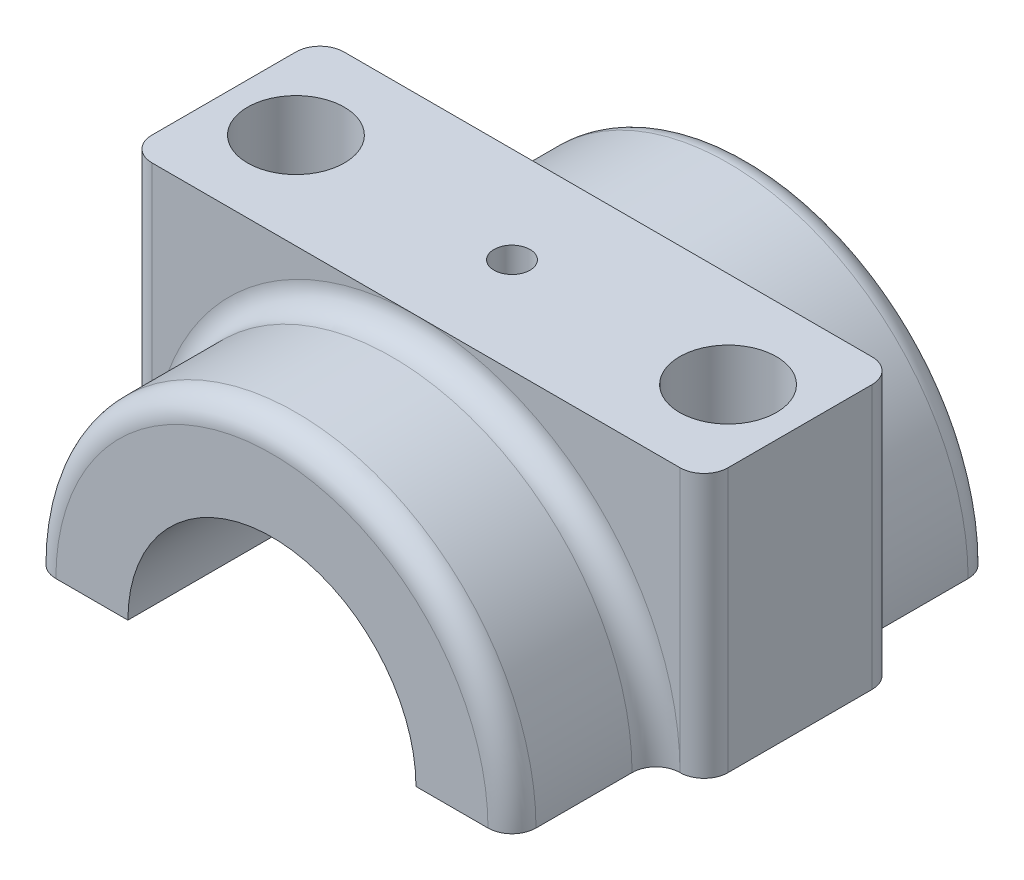
ISO-10303-21;
HEADER;
FILE_DESCRIPTION(('STEP AP214'),'2;1');
FILE_NAME('part.step','',(''),(''),'','','');
FILE_SCHEMA(('AUTOMOTIVE_DESIGN { 1 0 10303 214 1 1 1 1 }'));
ENDSEC;
DATA;
#1=APPLICATION_CONTEXT('core data for automotive mechanical design processes');
#2=APPLICATION_PROTOCOL_DEFINITION('international standard','automotive_design',2000,#1);
#3=PRODUCT_CONTEXT('',#1,'mechanical');
#4=PRODUCT('Part','Part','',(#3));
#5=PRODUCT_RELATED_PRODUCT_CATEGORY('part','',(#4));
#6=PRODUCT_DEFINITION_FORMATION('','',#4);
#7=PRODUCT_DEFINITION_CONTEXT('part definition',#1,'design');
#8=PRODUCT_DEFINITION('design','',#6,#7);
#9=PRODUCT_DEFINITION_SHAPE('','',#8);
#10=(LENGTH_UNIT() NAMED_UNIT(*) SI_UNIT(.MILLI.,.METRE.));
#11=(NAMED_UNIT(*) PLANE_ANGLE_UNIT() SI_UNIT($,.RADIAN.));
#12=(NAMED_UNIT(*) SI_UNIT($,.STERADIAN.) SOLID_ANGLE_UNIT());
#13=UNCERTAINTY_MEASURE_WITH_UNIT(LENGTH_MEASURE(1.E-05),#10,'distance_accuracy_value','');
#14=(GEOMETRIC_REPRESENTATION_CONTEXT(3) GLOBAL_UNCERTAINTY_ASSIGNED_CONTEXT((#13)) GLOBAL_UNIT_ASSIGNED_CONTEXT((#10,
#11,#12)) REPRESENTATION_CONTEXT('',''));
#15=CARTESIAN_POINT('',(0.,0.,0.));
#16=DIRECTION('',(0.,0.,1.));
#17=DIRECTION('',(1.,0.,0.));
#18=AXIS2_PLACEMENT_3D('',#15,#16,#17);
#19=CARTESIAN_POINT('',(0.,33.,0.));
#20=DIRECTION('',(0.,0.,-1.));
#21=DIRECTION('',(-1.,0.,0.));
#22=AXIS2_PLACEMENT_3D('',#19,#20,#21);
#23=PLANE('',#22);
#24=DIRECTION('',(0.,-1.,0.));
#25=VECTOR('',#24,1.);
#26=CARTESIAN_POINT('',(3.,33.,0.));
#27=LINE('',#26,#25);
#28=CARTESIAN_POINT('',(3.,33.,0.));
#29=VERTEX_POINT('',#28);
#30=CARTESIAN_POINT('',(3.,0.,0.));
#31=VERTEX_POINT('',#30);
#32=EDGE_CURVE('E266',#29,#31,#27,.T.);
#33=ORIENTED_EDGE('',*,*,#32,.T.);
#34=CARTESIAN_POINT('',(36.,0.,0.));
#35=DIRECTION('',(0.,0.,-1.));
#36=DIRECTION('',(-1.,0.,0.));
#37=AXIS2_PLACEMENT_3D('',#34,#35,#36);
#38=CIRCLE('',#37,33.);
#39=CARTESIAN_POINT('',(36.,33.,0.));
#40=VERTEX_POINT('',#39);
#41=EDGE_CURVE('E46',#31,#40,#38,.T.);
#42=ORIENTED_EDGE('',*,*,#41,.T.);
#43=DIRECTION('',(1.,0.,0.));
#44=VECTOR('',#43,1.);
#45=CARTESIAN_POINT('',(0.,33.,0.));
#46=LINE('',#45,#44);
#47=EDGE_CURVE('E244',#29,#40,#46,.T.);
#48=ORIENTED_EDGE('',*,*,#47,.F.);
#49=EDGE_LOOP('',(#33,#42,#48));
#50=FACE_BOUND('',#49,.T.);
#51=ADVANCED_FACE('F31',(#50),#23,.F.);
#52=CARTESIAN_POINT('',(72.,33.,-24.));
#53=DIRECTION('',(0.,0.,1.));
#54=DIRECTION('',(1.,0.,0.));
#55=AXIS2_PLACEMENT_3D('',#52,#53,#54);
#56=PLANE('',#55);
#57=DIRECTION('',(0.,-1.,0.));
#58=VECTOR('',#57,1.);
#59=CARTESIAN_POINT('',(69.,33.,-24.));
#60=LINE('',#59,#58);
#61=CARTESIAN_POINT('',(69.,33.,-24.));
#62=VERTEX_POINT('',#61);
#63=CARTESIAN_POINT('',(69.,0.,-24.));
#64=VERTEX_POINT('',#63);
#65=EDGE_CURVE('E291',#62,#64,#60,.T.);
#66=ORIENTED_EDGE('',*,*,#65,.T.);
#67=CARTESIAN_POINT('',(36.,0.,-24.));
#68=DIRECTION('',(0.,0.,1.));
#69=DIRECTION('',(1.,0.,0.));
#70=AXIS2_PLACEMENT_3D('',#67,#68,#69);
#71=CIRCLE('',#70,33.);
#72=CARTESIAN_POINT('',(36.,33.,-24.));
#73=VERTEX_POINT('',#72);
#74=EDGE_CURVE('E54',#64,#73,#71,.T.);
#75=ORIENTED_EDGE('',*,*,#74,.T.);
#76=DIRECTION('',(-1.,0.,0.));
#77=VECTOR('',#76,1.);
#78=CARTESIAN_POINT('',(72.,33.,-24.));
#79=LINE('',#78,#77);
#80=EDGE_CURVE('E251',#62,#73,#79,.T.);
#81=ORIENTED_EDGE('',*,*,#80,.F.);
#82=EDGE_LOOP('',(#66,#75,#81));
#83=FACE_BOUND('',#82,.T.);
#84=ADVANCED_FACE('F366',(#83),#56,.F.);
#85=CARTESIAN_POINT('',(3.,33.,-24.));
#86=VERTEX_POINT('',#85);
#87=EDGE_CURVE('E250',#73,#86,#79,.T.);
#88=ORIENTED_EDGE('',*,*,#87,.F.);
#89=CARTESIAN_POINT('',(36.,0.,-24.));
#90=DIRECTION('',(0.,0.,1.));
#91=DIRECTION('',(1.,0.,0.));
#92=AXIS2_PLACEMENT_3D('',#89,#90,#91);
#93=CIRCLE('',#92,33.);
#94=CARTESIAN_POINT('',(3.,0.,-24.));
#95=VERTEX_POINT('',#94);
#96=EDGE_CURVE('E315',#73,#95,#93,.T.);
#97=ORIENTED_EDGE('',*,*,#96,.T.);
#98=DIRECTION('',(0.,-1.,0.));
#99=VECTOR('',#98,1.);
#100=CARTESIAN_POINT('',(3.,33.,-24.));
#101=LINE('',#100,#99);
#102=EDGE_CURVE('E293',#95,#86,#101,.F.);
#103=ORIENTED_EDGE('',*,*,#102,.T.);
#104=EDGE_LOOP('',(#88,#97,#103));
#105=FACE_BOUND('',#104,.T.);
#106=ADVANCED_FACE('F372',(#105),#56,.F.);
#107=CARTESIAN_POINT('',(69.,33.,0.));
#108=VERTEX_POINT('',#107);
#109=EDGE_CURVE('E243',#40,#108,#46,.T.);
#110=ORIENTED_EDGE('',*,*,#109,.F.);
#111=CARTESIAN_POINT('',(36.,0.,0.));
#112=DIRECTION('',(0.,0.,-1.));
#113=DIRECTION('',(-1.,0.,0.));
#114=AXIS2_PLACEMENT_3D('',#111,#112,#113);
#115=CIRCLE('',#114,33.);
#116=CARTESIAN_POINT('',(69.,0.,0.));
#117=VERTEX_POINT('',#116);
#118=EDGE_CURVE('E326',#40,#117,#115,.T.);
#119=ORIENTED_EDGE('',*,*,#118,.T.);
#120=DIRECTION('',(0.,-1.,0.));
#121=VECTOR('',#120,1.);
#122=CARTESIAN_POINT('',(69.,33.,0.));
#123=LINE('',#122,#121);
#124=EDGE_CURVE('E254',#117,#108,#123,.F.);
#125=ORIENTED_EDGE('',*,*,#124,.T.);
#126=EDGE_LOOP('',(#110,#119,#125));
#127=FACE_BOUND('',#126,.T.);
#128=ADVANCED_FACE('F345',(#127),#23,.F.);
#129=CARTESIAN_POINT('',(0.,33.,0.));
#130=DIRECTION('',(0.,1.,0.));
#131=DIRECTION('',(0.,0.,1.));
#132=AXIS2_PLACEMENT_3D('',#129,#130,#131);
#133=PLANE('',#132);
#134=CARTESIAN_POINT('',(63.,33.,-12.));
#135=DIRECTION('',(0.,1.,0.));
#136=DIRECTION('',(0.,0.,1.));
#137=AXIS2_PLACEMENT_3D('',#134,#135,#136);
#138=CIRCLE('',#137,6.04999999999998);
#139=CARTESIAN_POINT('',(63.,33.,-5.95000000000002));
#140=VERTEX_POINT('',#139);
#141=EDGE_CURVE('E228',#140,#140,#138,.T.);
#142=ORIENTED_EDGE('',*,*,#141,.F.);
#143=EDGE_LOOP('',(#142));
#144=FACE_BOUND('',#143,.T.);
#145=DIRECTION('',(0.,0.,1.));
#146=VECTOR('',#145,1.);
#147=CARTESIAN_POINT('',(0.,33.,-24.));
#148=LINE('',#147,#146);
#149=CARTESIAN_POINT('',(0.,33.,-21.));
#150=VERTEX_POINT('',#149);
#151=CARTESIAN_POINT('',(0.,33.,-3.));
#152=VERTEX_POINT('',#151);
#153=EDGE_CURVE('E240',#150,#152,#148,.T.);
#154=ORIENTED_EDGE('',*,*,#153,.T.);
#155=CARTESIAN_POINT('',(3.,33.,-3.));
#156=DIRECTION('',(0.,1.,0.));
#157=DIRECTION('',(0.,0.,1.));
#158=AXIS2_PLACEMENT_3D('',#155,#156,#157);
#159=CIRCLE('',#158,3.);
#160=EDGE_CURVE('E289',#152,#29,#159,.T.);
#161=ORIENTED_EDGE('',*,*,#160,.T.);
#162=ORIENTED_EDGE('',*,*,#47,.T.);
#163=ORIENTED_EDGE('',*,*,#109,.T.);
#164=CARTESIAN_POINT('',(69.,33.,-3.));
#165=DIRECTION('',(0.,1.,0.));
#166=DIRECTION('',(0.,0.,1.));
#167=AXIS2_PLACEMENT_3D('',#164,#165,#166);
#168=CIRCLE('',#167,3.);
#169=CARTESIAN_POINT('',(72.,33.,-3.));
#170=VERTEX_POINT('',#169);
#171=EDGE_CURVE('E283',#108,#170,#168,.T.);
#172=ORIENTED_EDGE('',*,*,#171,.T.);
#173=DIRECTION('',(0.,0.,-1.));
#174=VECTOR('',#173,1.);
#175=CARTESIAN_POINT('',(72.,33.,0.));
#176=LINE('',#175,#174);
#177=CARTESIAN_POINT('',(72.,33.,-21.));
#178=VERTEX_POINT('',#177);
#179=EDGE_CURVE('E247',#170,#178,#176,.T.);
#180=ORIENTED_EDGE('',*,*,#179,.T.);
#181=CARTESIAN_POINT('',(69.,33.,-21.));
#182=DIRECTION('',(0.,1.,0.));
#183=DIRECTION('',(0.,0.,1.));
#184=AXIS2_PLACEMENT_3D('',#181,#182,#183);
#185=CIRCLE('',#184,3.);
#186=EDGE_CURVE('E285',#178,#62,#185,.T.);
#187=ORIENTED_EDGE('',*,*,#186,.T.);
#188=ORIENTED_EDGE('',*,*,#80,.T.);
#189=ORIENTED_EDGE('',*,*,#87,.T.);
#190=CARTESIAN_POINT('',(3.,33.,-21.));
#191=DIRECTION('',(0.,1.,0.));
#192=DIRECTION('',(0.,0.,1.));
#193=AXIS2_PLACEMENT_3D('',#190,#191,#192);
#194=CIRCLE('',#193,3.);
#195=EDGE_CURVE('E287',#86,#150,#194,.T.);
#196=ORIENTED_EDGE('',*,*,#195,.T.);
#197=EDGE_LOOP('',(#154,#161,#162,#163,#172,#180,#187,#188,#189,#196));
#198=FACE_BOUND('',#197,.T.);
#199=CARTESIAN_POINT('',(8.99999999999999,33.,-12.));
#200=DIRECTION('',(0.,1.,0.));
#201=DIRECTION('',(0.,0.,1.));
#202=AXIS2_PLACEMENT_3D('',#199,#200,#201);
#203=CIRCLE('',#202,6.05);
#204=CARTESIAN_POINT('',(8.99999999999999,33.,-5.95));
#205=VERTEX_POINT('',#204);
#206=EDGE_CURVE('E234',#205,#205,#203,.T.);
#207=ORIENTED_EDGE('',*,*,#206,.F.);
#208=EDGE_LOOP('',(#207));
#209=FACE_BOUND('',#208,.T.);
#210=CARTESIAN_POINT('',(36.,33.,-12.));
#211=DIRECTION('',(0.,1.,0.));
#212=DIRECTION('',(0.,0.,1.));
#213=AXIS2_PLACEMENT_3D('',#210,#211,#212);
#214=CIRCLE('',#213,2.25);
#215=CARTESIAN_POINT('',(36.,33.,-9.75));
#216=VERTEX_POINT('',#215);
#217=EDGE_CURVE('E222',#216,#216,#214,.T.);
#218=ORIENTED_EDGE('',*,*,#217,.F.);
#219=EDGE_LOOP('',(#218));
#220=FACE_BOUND('',#219,.T.);
#221=ADVANCED_FACE('F355',(#144,#198,#209,#220),#133,.T.);
#222=CARTESIAN_POINT('',(0.,0.,0.));
#223=DIRECTION('',(0.,1.,0.));
#224=DIRECTION('',(0.,0.,1.));
#225=AXIS2_PLACEMENT_3D('',#222,#223,#224);
#226=PLANE('',#225);
#227=CARTESIAN_POINT('',(63.,0.,-12.));
#228=DIRECTION('',(0.,1.,0.));
#229=DIRECTION('',(0.,0.,1.));
#230=AXIS2_PLACEMENT_3D('',#227,#228,#229);
#231=CIRCLE('',#230,6.04999999999998);
#232=CARTESIAN_POINT('',(63.,0.,-5.95000000000002));
#233=VERTEX_POINT('',#232);
#234=EDGE_CURVE('E225',#233,#233,#231,.T.);
#235=ORIENTED_EDGE('',*,*,#234,.T.);
#236=EDGE_LOOP('',(#235));
#237=FACE_BOUND('',#236,.T.);
#238=DIRECTION('',(-1.,0.,0.));
#239=VECTOR('',#238,1.);
#240=CARTESIAN_POINT('',(-21.5367608882934,0.,-42.));
#241=LINE('',#240,#239);
#242=CARTESIAN_POINT('',(63.,0.,-42.));
#243=VERTEX_POINT('',#242);
#244=CARTESIAN_POINT('',(54.,0.,-42.));
#245=VERTEX_POINT('',#244);
#246=EDGE_CURVE('E166',#243,#245,#241,.T.);
#247=ORIENTED_EDGE('',*,*,#246,.F.);
#248=CARTESIAN_POINT('',(63.,0.,-39.));
#249=DIRECTION('',(0.,1.,0.));
#250=DIRECTION('',(0.,0.,1.));
#251=AXIS2_PLACEMENT_3D('',#248,#249,#250);
#252=CIRCLE('',#251,3.);
#253=CARTESIAN_POINT('',(66.,0.,-39.));
#254=VERTEX_POINT('',#253);
#255=EDGE_CURVE('E308',#243,#254,#252,.F.);
#256=ORIENTED_EDGE('',*,*,#255,.T.);
#257=DIRECTION('',(0.,0.,1.));
#258=VECTOR('',#257,1.);
#259=CARTESIAN_POINT('',(66.,0.,-42.));
#260=LINE('',#259,#258);
#261=CARTESIAN_POINT('',(66.,0.,-27.));
#262=VERTEX_POINT('',#261);
#263=EDGE_CURVE('E186',#254,#262,#260,.T.);
#264=ORIENTED_EDGE('',*,*,#263,.T.);
#265=CARTESIAN_POINT('',(69.,0.,-27.));
#266=DIRECTION('',(0.,1.,0.));
#267=DIRECTION('',(0.,0.,1.));
#268=AXIS2_PLACEMENT_3D('',#265,#266,#267);
#269=CIRCLE('',#268,3.);
#270=EDGE_CURVE('E329',#262,#64,#269,.T.);
#271=ORIENTED_EDGE('',*,*,#270,.T.);
#272=CARTESIAN_POINT('',(69.,0.,-21.));
#273=DIRECTION('',(0.,1.,0.));
#274=DIRECTION('',(0.,0.,1.));
#275=AXIS2_PLACEMENT_3D('',#272,#273,#274);
#276=CIRCLE('',#275,3.);
#277=CARTESIAN_POINT('',(72.,0.,-21.));
#278=VERTEX_POINT('',#277);
#279=EDGE_CURVE('E271',#64,#278,#276,.F.);
#280=ORIENTED_EDGE('',*,*,#279,.T.);
#281=DIRECTION('',(0.,0.,-1.));
#282=VECTOR('',#281,1.);
#283=CARTESIAN_POINT('',(72.,0.,0.));
#284=LINE('',#283,#282);
#285=CARTESIAN_POINT('',(72.,0.,-3.));
#286=VERTEX_POINT('',#285);
#287=EDGE_CURVE('E260',#286,#278,#284,.T.);
#288=ORIENTED_EDGE('',*,*,#287,.F.);
#289=CARTESIAN_POINT('',(69.,0.,-3.));
#290=DIRECTION('',(0.,1.,0.));
#291=DIRECTION('',(0.,0.,1.));
#292=AXIS2_PLACEMENT_3D('',#289,#290,#291);
#293=CIRCLE('',#292,3.);
#294=EDGE_CURVE('E268',#286,#117,#293,.F.);
#295=ORIENTED_EDGE('',*,*,#294,.T.);
#296=CARTESIAN_POINT('',(69.,0.,3.));
#297=DIRECTION('',(0.,1.,0.));
#298=DIRECTION('',(0.,0.,1.));
#299=AXIS2_PLACEMENT_3D('',#296,#297,#298);
#300=CIRCLE('',#299,3.);
#301=CARTESIAN_POINT('',(66.,0.,3.));
#302=VERTEX_POINT('',#301);
#303=EDGE_CURVE('E11',#117,#302,#300,.T.);
#304=ORIENTED_EDGE('',*,*,#303,.T.);
#305=DIRECTION('',(0.,0.,-1.));
#306=VECTOR('',#305,1.);
#307=CARTESIAN_POINT('',(66.,0.,18.));
#308=LINE('',#307,#306);
#309=CARTESIAN_POINT('',(66.,0.,15.));
#310=VERTEX_POINT('',#309);
#311=EDGE_CURVE('E218',#310,#302,#308,.T.);
#312=ORIENTED_EDGE('',*,*,#311,.F.);
#313=CARTESIAN_POINT('',(63.,0.,15.));
#314=DIRECTION('',(0.,1.,0.));
#315=DIRECTION('',(0.,0.,1.));
#316=AXIS2_PLACEMENT_3D('',#313,#314,#315);
#317=CIRCLE('',#316,3.);
#318=CARTESIAN_POINT('',(63.,0.,18.));
#319=VERTEX_POINT('',#318);
#320=EDGE_CURVE('E302',#310,#319,#317,.F.);
#321=ORIENTED_EDGE('',*,*,#320,.T.);
#322=DIRECTION('',(1.,0.,0.));
#323=VECTOR('',#322,1.);
#324=CARTESIAN_POINT('',(36.,0.,18.));
#325=LINE('',#324,#323);
#326=CARTESIAN_POINT('',(54.,0.,18.));
#327=VERTEX_POINT('',#326);
#328=EDGE_CURVE('E202',#327,#319,#325,.T.);
#329=ORIENTED_EDGE('',*,*,#328,.F.);
#330=DIRECTION('',(0.,0.,-1.));
#331=VECTOR('',#330,1.);
#332=CARTESIAN_POINT('',(54.,0.,18.));
#333=LINE('',#332,#331);
#334=CARTESIAN_POINT('',(54.,0.,0.));
#335=VERTEX_POINT('',#334);
#336=EDGE_CURVE('E209',#327,#335,#333,.T.);
#337=ORIENTED_EDGE('',*,*,#336,.T.);
#338=DIRECTION('',(1.,0.,0.));
#339=VECTOR('',#338,1.);
#340=CARTESIAN_POINT('',(0.,0.,0.));
#341=LINE('',#340,#339);
#342=CARTESIAN_POINT('',(18.,0.,0.));
#343=VERTEX_POINT('',#342);
#344=EDGE_CURVE('E257',#343,#335,#341,.T.);
#345=ORIENTED_EDGE('',*,*,#344,.F.);
#346=DIRECTION('',(0.,0.,-1.));
#347=VECTOR('',#346,1.);
#348=CARTESIAN_POINT('',(18.,0.,18.));
#349=LINE('',#348,#347);
#350=CARTESIAN_POINT('',(18.,0.,18.));
#351=VERTEX_POINT('',#350);
#352=EDGE_CURVE('E213',#351,#343,#349,.T.);
#353=ORIENTED_EDGE('',*,*,#352,.F.);
#354=CARTESIAN_POINT('',(8.99999999999999,0.,18.));
#355=VERTEX_POINT('',#354);
#356=EDGE_CURVE('E205',#355,#351,#325,.T.);
#357=ORIENTED_EDGE('',*,*,#356,.F.);
#358=CARTESIAN_POINT('',(8.99999999999999,0.,15.));
#359=DIRECTION('',(0.,1.,0.));
#360=DIRECTION('',(0.,0.,1.));
#361=AXIS2_PLACEMENT_3D('',#358,#359,#360);
#362=CIRCLE('',#361,3.);
#363=CARTESIAN_POINT('',(6.,0.,15.));
#364=VERTEX_POINT('',#363);
#365=EDGE_CURVE('E304',#355,#364,#362,.F.);
#366=ORIENTED_EDGE('',*,*,#365,.T.);
#367=DIRECTION('',(0.,0.,-1.));
#368=VECTOR('',#367,1.);
#369=CARTESIAN_POINT('',(6.,0.,18.));
#370=LINE('',#369,#368);
#371=CARTESIAN_POINT('',(6.,0.,3.));
#372=VERTEX_POINT('',#371);
#373=EDGE_CURVE('E215',#364,#372,#370,.T.);
#374=ORIENTED_EDGE('',*,*,#373,.T.);
#375=CARTESIAN_POINT('',(3.,0.,3.));
#376=DIRECTION('',(0.,1.,0.));
#377=DIRECTION('',(0.,0.,1.));
#378=AXIS2_PLACEMENT_3D('',#375,#376,#377);
#379=CIRCLE('',#378,3.);
#380=EDGE_CURVE('E39',#372,#31,#379,.T.);
#381=ORIENTED_EDGE('',*,*,#380,.T.);
#382=CARTESIAN_POINT('',(3.,0.,-3.));
#383=DIRECTION('',(0.,1.,0.));
#384=DIRECTION('',(0.,0.,1.));
#385=AXIS2_PLACEMENT_3D('',#382,#383,#384);
#386=CIRCLE('',#385,3.);
#387=CARTESIAN_POINT('',(0.,0.,-3.));
#388=VERTEX_POINT('',#387);
#389=EDGE_CURVE('E276',#31,#388,#386,.F.);
#390=ORIENTED_EDGE('',*,*,#389,.T.);
#391=DIRECTION('',(0.,0.,1.));
#392=VECTOR('',#391,1.);
#393=CARTESIAN_POINT('',(0.,0.,-24.));
#394=LINE('',#393,#392);
#395=CARTESIAN_POINT('',(0.,0.,-21.));
#396=VERTEX_POINT('',#395);
#397=EDGE_CURVE('E237',#396,#388,#394,.T.);
#398=ORIENTED_EDGE('',*,*,#397,.F.);
#399=CARTESIAN_POINT('',(3.,0.,-21.));
#400=DIRECTION('',(0.,1.,0.));
#401=DIRECTION('',(0.,0.,1.));
#402=AXIS2_PLACEMENT_3D('',#399,#400,#401);
#403=CIRCLE('',#402,3.);
#404=EDGE_CURVE('E273',#396,#95,#403,.F.);
#405=ORIENTED_EDGE('',*,*,#404,.T.);
#406=CARTESIAN_POINT('',(2.99999999999999,0.,-27.));
#407=DIRECTION('',(0.,1.,0.));
#408=DIRECTION('',(0.,0.,1.));
#409=AXIS2_PLACEMENT_3D('',#406,#407,#408);
#410=CIRCLE('',#409,3.);
#411=CARTESIAN_POINT('',(6.,0.,-27.));
#412=VERTEX_POINT('',#411);
#413=EDGE_CURVE('E331',#95,#412,#410,.T.);
#414=ORIENTED_EDGE('',*,*,#413,.T.);
#415=DIRECTION('',(0.,0.,1.));
#416=VECTOR('',#415,1.);
#417=CARTESIAN_POINT('',(6.,0.,-42.));
#418=LINE('',#417,#416);
#419=CARTESIAN_POINT('',(6.,0.,-39.));
#420=VERTEX_POINT('',#419);
#421=EDGE_CURVE('E198',#420,#412,#418,.T.);
#422=ORIENTED_EDGE('',*,*,#421,.F.);
#423=CARTESIAN_POINT('',(8.99999999999999,0.,-39.));
#424=DIRECTION('',(0.,1.,0.));
#425=DIRECTION('',(0.,0.,1.));
#426=AXIS2_PLACEMENT_3D('',#423,#424,#425);
#427=CIRCLE('',#426,3.);
#428=CARTESIAN_POINT('',(8.99999999999999,0.,-42.));
#429=VERTEX_POINT('',#428);
#430=EDGE_CURVE('E306',#420,#429,#427,.F.);
#431=ORIENTED_EDGE('',*,*,#430,.T.);
#432=CARTESIAN_POINT('',(18.,0.,-42.));
#433=VERTEX_POINT('',#432);
#434=EDGE_CURVE('E175',#433,#429,#241,.T.);
#435=ORIENTED_EDGE('',*,*,#434,.F.);
#436=DIRECTION('',(0.,0.,1.));
#437=VECTOR('',#436,1.);
#438=CARTESIAN_POINT('',(18.,0.,-42.));
#439=LINE('',#438,#437);
#440=CARTESIAN_POINT('',(18.,0.,-24.));
#441=VERTEX_POINT('',#440);
#442=EDGE_CURVE('E187',#433,#441,#439,.T.);
#443=ORIENTED_EDGE('',*,*,#442,.T.);
#444=DIRECTION('',(-1.,0.,0.));
#445=VECTOR('',#444,1.);
#446=CARTESIAN_POINT('',(72.,0.,-24.));
#447=LINE('',#446,#445);
#448=CARTESIAN_POINT('',(54.,0.,-24.));
#449=VERTEX_POINT('',#448);
#450=EDGE_CURVE('E182',#449,#441,#447,.T.);
#451=ORIENTED_EDGE('',*,*,#450,.F.);
#452=DIRECTION('',(0.,0.,1.));
#453=VECTOR('',#452,1.);
#454=CARTESIAN_POINT('',(54.,0.,-42.));
#455=LINE('',#454,#453);
#456=EDGE_CURVE('E178',#245,#449,#455,.T.);
#457=ORIENTED_EDGE('',*,*,#456,.F.);
#458=EDGE_LOOP('',(#247,#256,#264,#271,#280,#288,#295,#304,#312,#321,#329,#337,#345,#353,#357,
#366,#374,#381,#390,#398,#405,#414,#422,#431,#435,#443,#451,#457));
#459=FACE_BOUND('',#458,.T.);
#460=CARTESIAN_POINT('',(8.99999999999999,0.,-12.));
#461=DIRECTION('',(0.,1.,0.));
#462=DIRECTION('',(0.,0.,1.));
#463=AXIS2_PLACEMENT_3D('',#460,#461,#462);
#464=CIRCLE('',#463,6.05);
#465=CARTESIAN_POINT('',(8.99999999999999,0.,-5.95));
#466=VERTEX_POINT('',#465);
#467=EDGE_CURVE('E231',#466,#466,#464,.T.);
#468=ORIENTED_EDGE('',*,*,#467,.T.);
#469=EDGE_LOOP('',(#468));
#470=FACE_BOUND('',#469,.T.);
#471=CARTESIAN_POINT('',(36.,0.,-12.));
#472=DIRECTION('',(0.,1.,0.));
#473=DIRECTION('',(0.,0.,1.));
#474=AXIS2_PLACEMENT_3D('',#471,#472,#473);
#475=CIRCLE('',#474,2.25);
#476=CARTESIAN_POINT('',(36.,0.,-9.75));
#477=VERTEX_POINT('',#476);
#478=EDGE_CURVE('E221',#477,#477,#475,.T.);
#479=ORIENTED_EDGE('',*,*,#478,.T.);
#480=EDGE_LOOP('',(#479));
#481=FACE_BOUND('',#480,.T.);
#482=ADVANCED_FACE('F179',(#237,#459,#470,#481),#226,.F.);
#483=CARTESIAN_POINT('',(0.,33.,-24.));
#484=DIRECTION('',(1.,0.,0.));
#485=DIRECTION('',(0.,0.,-1.));
#486=AXIS2_PLACEMENT_3D('',#483,#484,#485);
#487=PLANE('',#486);
#488=ORIENTED_EDGE('',*,*,#397,.T.);
#489=DIRECTION('',(0.,-1.,0.));
#490=VECTOR('',#489,1.);
#491=CARTESIAN_POINT('',(0.,33.,-3.));
#492=LINE('',#491,#490);
#493=EDGE_CURVE('E281',#388,#152,#492,.F.);
#494=ORIENTED_EDGE('',*,*,#493,.T.);
#495=ORIENTED_EDGE('',*,*,#153,.F.);
#496=DIRECTION('',(0.,-1.,0.));
#497=VECTOR('',#496,1.);
#498=CARTESIAN_POINT('',(0.,33.,-21.));
#499=LINE('',#498,#497);
#500=EDGE_CURVE('E278',#150,#396,#499,.T.);
#501=ORIENTED_EDGE('',*,*,#500,.T.);
#502=EDGE_LOOP('',(#488,#494,#495,#501));
#503=FACE_BOUND('',#502,.T.);
#504=ADVANCED_FACE('F381',(#503),#487,.F.);
#505=ORIENTED_EDGE('',*,*,#344,.T.);
#506=CARTESIAN_POINT('',(36.,0.,0.));
#507=DIRECTION('',(0.,0.,1.));
#508=DIRECTION('',(1.,0.,0.));
#509=AXIS2_PLACEMENT_3D('',#506,#507,#508);
#510=CIRCLE('',#509,18.);
#511=EDGE_CURVE('E201',#335,#343,#510,.T.);
#512=ORIENTED_EDGE('',*,*,#511,.T.);
#513=EDGE_LOOP('',(#505,#512));
#514=FACE_BOUND('',#513,.T.);
#515=ADVANCED_FACE('F383',(#514),#23,.F.);
#516=CARTESIAN_POINT('',(72.,33.,0.));
#517=DIRECTION('',(-1.,0.,0.));
#518=DIRECTION('',(0.,0.,1.));
#519=AXIS2_PLACEMENT_3D('',#516,#517,#518);
#520=PLANE('',#519);
#521=ORIENTED_EDGE('',*,*,#287,.T.);
#522=DIRECTION('',(0.,-1.,0.));
#523=VECTOR('',#522,1.);
#524=CARTESIAN_POINT('',(72.,33.,-21.));
#525=LINE('',#524,#523);
#526=EDGE_CURVE('E299',#278,#178,#525,.F.);
#527=ORIENTED_EDGE('',*,*,#526,.T.);
#528=ORIENTED_EDGE('',*,*,#179,.F.);
#529=DIRECTION('',(0.,-1.,0.));
#530=VECTOR('',#529,1.);
#531=CARTESIAN_POINT('',(72.,33.,-3.));
#532=LINE('',#531,#530);
#533=EDGE_CURVE('E296',#170,#286,#532,.T.);
#534=ORIENTED_EDGE('',*,*,#533,.T.);
#535=EDGE_LOOP('',(#521,#527,#528,#534));
#536=FACE_BOUND('',#535,.T.);
#537=ADVANCED_FACE('F359',(#536),#520,.F.);
#538=ORIENTED_EDGE('',*,*,#450,.T.);
#539=CARTESIAN_POINT('',(36.,0.,-24.));
#540=DIRECTION('',(0.,0.,-1.));
#541=DIRECTION('',(-1.,0.,0.));
#542=AXIS2_PLACEMENT_3D('',#539,#540,#541);
#543=CIRCLE('',#542,18.);
#544=EDGE_CURVE('E194',#441,#449,#543,.T.);
#545=ORIENTED_EDGE('',*,*,#544,.T.);
#546=EDGE_LOOP('',(#538,#545));
#547=FACE_BOUND('',#546,.T.);
#548=ADVANCED_FACE('F399',(#547),#56,.F.);
#549=CARTESIAN_POINT('',(8.99999999999999,33.,-12.));
#550=DIRECTION('',(0.,-1.,0.));
#551=DIRECTION('',(0.,0.,-1.));
#552=AXIS2_PLACEMENT_3D('',#549,#550,#551);
#553=CYLINDRICAL_SURFACE('',#552,6.05);
#554=ORIENTED_EDGE('',*,*,#206,.T.);
#555=EDGE_LOOP('',(#554));
#556=FACE_BOUND('',#555,.T.);
#557=ORIENTED_EDGE('',*,*,#467,.F.);
#558=EDGE_LOOP('',(#557));
#559=FACE_BOUND('',#558,.T.);
#560=ADVANCED_FACE('F411',(#556,#559),#553,.F.);
#561=CARTESIAN_POINT('',(63.,33.,-12.));
#562=DIRECTION('',(0.,-1.,0.));
#563=DIRECTION('',(0.,0.,-1.));
#564=AXIS2_PLACEMENT_3D('',#561,#562,#563);
#565=CYLINDRICAL_SURFACE('',#564,6.04999999999998);
#566=ORIENTED_EDGE('',*,*,#141,.T.);
#567=EDGE_LOOP('',(#566));
#568=FACE_BOUND('',#567,.T.);
#569=ORIENTED_EDGE('',*,*,#234,.F.);
#570=EDGE_LOOP('',(#569));
#571=FACE_BOUND('',#570,.T.);
#572=ADVANCED_FACE('F417',(#568,#571),#565,.F.);
#573=CARTESIAN_POINT('',(36.,33.,-12.));
#574=DIRECTION('',(0.,-1.,0.));
#575=DIRECTION('',(0.,0.,-1.));
#576=AXIS2_PLACEMENT_3D('',#573,#574,#575);
#577=CYLINDRICAL_SURFACE('',#576,2.25);
#578=ORIENTED_EDGE('',*,*,#217,.T.);
#579=EDGE_LOOP('',(#578));
#580=FACE_BOUND('',#579,.T.);
#581=ORIENTED_EDGE('',*,*,#478,.F.);
#582=EDGE_LOOP('',(#581));
#583=FACE_BOUND('',#582,.T.);
#584=ADVANCED_FACE('F506',(#580,#583),#577,.F.);
#585=CARTESIAN_POINT('',(3.,33.,-3.));
#586=DIRECTION('',(0.,-1.,0.));
#587=DIRECTION('',(0.,0.,-1.));
#588=AXIS2_PLACEMENT_3D('',#585,#586,#587);
#589=CYLINDRICAL_SURFACE('',#588,3.);
#590=ORIENTED_EDGE('',*,*,#160,.F.);
#591=ORIENTED_EDGE('',*,*,#493,.F.);
#592=ORIENTED_EDGE('',*,*,#389,.F.);
#593=ORIENTED_EDGE('',*,*,#32,.F.);
#594=EDGE_LOOP('',(#590,#591,#592,#593));
#595=FACE_BOUND('',#594,.T.);
#596=ADVANCED_FACE('F341',(#595),#589,.T.);
#597=CARTESIAN_POINT('',(3.,33.,-21.));
#598=DIRECTION('',(0.,-1.,0.));
#599=DIRECTION('',(0.,0.,-1.));
#600=AXIS2_PLACEMENT_3D('',#597,#598,#599);
#601=CYLINDRICAL_SURFACE('',#600,3.);
#602=ORIENTED_EDGE('',*,*,#195,.F.);
#603=ORIENTED_EDGE('',*,*,#102,.F.);
#604=ORIENTED_EDGE('',*,*,#404,.F.);
#605=ORIENTED_EDGE('',*,*,#500,.F.);
#606=EDGE_LOOP('',(#602,#603,#604,#605));
#607=FACE_BOUND('',#606,.T.);
#608=ADVANCED_FACE('F378',(#607),#601,.T.);
#609=CARTESIAN_POINT('',(69.,33.,-21.));
#610=DIRECTION('',(0.,-1.,0.));
#611=DIRECTION('',(0.,0.,-1.));
#612=AXIS2_PLACEMENT_3D('',#609,#610,#611);
#613=CYLINDRICAL_SURFACE('',#612,3.);
#614=ORIENTED_EDGE('',*,*,#186,.F.);
#615=ORIENTED_EDGE('',*,*,#526,.F.);
#616=ORIENTED_EDGE('',*,*,#279,.F.);
#617=ORIENTED_EDGE('',*,*,#65,.F.);
#618=EDGE_LOOP('',(#614,#615,#616,#617));
#619=FACE_BOUND('',#618,.T.);
#620=ADVANCED_FACE('F363',(#619),#613,.T.);
#621=CARTESIAN_POINT('',(69.,33.,-3.));
#622=DIRECTION('',(0.,-1.,0.));
#623=DIRECTION('',(0.,0.,-1.));
#624=AXIS2_PLACEMENT_3D('',#621,#622,#623);
#625=CYLINDRICAL_SURFACE('',#624,3.);
#626=ORIENTED_EDGE('',*,*,#171,.F.);
#627=ORIENTED_EDGE('',*,*,#124,.F.);
#628=ORIENTED_EDGE('',*,*,#294,.F.);
#629=ORIENTED_EDGE('',*,*,#533,.F.);
#630=EDGE_LOOP('',(#626,#627,#628,#629));
#631=FACE_BOUND('',#630,.T.);
#632=ADVANCED_FACE('F352',(#631),#625,.T.);
#633=CARTESIAN_POINT('',(36.,0.,18.));
#634=DIRECTION('',(0.,0.,-1.));
#635=DIRECTION('',(-1.,0.,0.));
#636=AXIS2_PLACEMENT_3D('',#633,#634,#635);
#637=CYLINDRICAL_SURFACE('',#636,30.);
#638=ORIENTED_EDGE('',*,*,#373,.F.);
#639=CARTESIAN_POINT('',(36.,0.,15.));
#640=DIRECTION('',(0.,0.,1.));
#641=DIRECTION('',(1.,0.,0.));
#642=AXIS2_PLACEMENT_3D('',#639,#640,#641);
#643=CIRCLE('',#642,30.);
#644=EDGE_CURVE('E324',#364,#310,#643,.F.);
#645=ORIENTED_EDGE('',*,*,#644,.T.);
#646=ORIENTED_EDGE('',*,*,#311,.T.);
#647=CARTESIAN_POINT('',(36.,0.,3.));
#648=DIRECTION('',(0.,0.,-1.));
#649=DIRECTION('',(-1.,0.,0.));
#650=AXIS2_PLACEMENT_3D('',#647,#648,#649);
#651=CIRCLE('',#650,30.);
#652=EDGE_CURVE('E321',#302,#372,#651,.F.);
#653=ORIENTED_EDGE('',*,*,#652,.T.);
#654=EDGE_LOOP('',(#638,#645,#646,#653));
#655=FACE_BOUND('',#654,.T.);
#656=ADVANCED_FACE('F437',(#655),#637,.T.);
#657=CARTESIAN_POINT('',(36.,0.,18.));
#658=DIRECTION('',(0.,0.,-1.));
#659=DIRECTION('',(-1.,0.,0.));
#660=AXIS2_PLACEMENT_3D('',#657,#658,#659);
#661=CYLINDRICAL_SURFACE('',#660,18.);
#662=ORIENTED_EDGE('',*,*,#511,.F.);
#663=ORIENTED_EDGE('',*,*,#336,.F.);
#664=CARTESIAN_POINT('',(36.,0.,18.));
#665=DIRECTION('',(0.,0.,1.));
#666=DIRECTION('',(1.,0.,0.));
#667=AXIS2_PLACEMENT_3D('',#664,#665,#666);
#668=CIRCLE('',#667,18.);
#669=EDGE_CURVE('E206',#327,#351,#668,.T.);
#670=ORIENTED_EDGE('',*,*,#669,.T.);
#671=ORIENTED_EDGE('',*,*,#352,.T.);
#672=EDGE_LOOP('',(#662,#663,#670,#671));
#673=FACE_BOUND('',#672,.T.);
#674=ADVANCED_FACE('F432',(#673),#661,.F.);
#675=CARTESIAN_POINT('',(36.,-41.0367608882934,18.));
#676=DIRECTION('',(0.,0.,1.));
#677=DIRECTION('',(1.,0.,0.));
#678=AXIS2_PLACEMENT_3D('',#675,#676,#677);
#679=PLANE('',#678);
#680=ORIENTED_EDGE('',*,*,#328,.T.);
#681=CARTESIAN_POINT('',(36.,0.,18.));
#682=DIRECTION('',(0.,0.,1.));
#683=DIRECTION('',(1.,0.,0.));
#684=AXIS2_PLACEMENT_3D('',#681,#682,#683);
#685=CIRCLE('',#684,27.);
#686=EDGE_CURVE('E318',#319,#355,#685,.T.);
#687=ORIENTED_EDGE('',*,*,#686,.T.);
#688=ORIENTED_EDGE('',*,*,#356,.T.);
#689=ORIENTED_EDGE('',*,*,#669,.F.);
#690=EDGE_LOOP('',(#680,#687,#688,#689));
#691=FACE_BOUND('',#690,.T.);
#692=ADVANCED_FACE('F436',(#691),#679,.T.);
#693=CARTESIAN_POINT('',(36.,0.,-42.));
#694=DIRECTION('',(0.,0.,1.));
#695=DIRECTION('',(1.,0.,0.));
#696=AXIS2_PLACEMENT_3D('',#693,#694,#695);
#697=CYLINDRICAL_SURFACE('',#696,30.);
#698=ORIENTED_EDGE('',*,*,#263,.F.);
#699=CARTESIAN_POINT('',(36.,0.,-39.));
#700=DIRECTION('',(0.,0.,-1.));
#701=DIRECTION('',(-1.,0.,0.));
#702=AXIS2_PLACEMENT_3D('',#699,#700,#701);
#703=CIRCLE('',#702,30.);
#704=EDGE_CURVE('E313',#254,#420,#703,.F.);
#705=ORIENTED_EDGE('',*,*,#704,.T.);
#706=ORIENTED_EDGE('',*,*,#421,.T.);
#707=CARTESIAN_POINT('',(36.,0.,-27.));
#708=DIRECTION('',(0.,0.,1.));
#709=DIRECTION('',(1.,0.,0.));
#710=AXIS2_PLACEMENT_3D('',#707,#708,#709);
#711=CIRCLE('',#710,30.);
#712=EDGE_CURVE('E310',#412,#262,#711,.F.);
#713=ORIENTED_EDGE('',*,*,#712,.T.);
#714=EDGE_LOOP('',(#698,#705,#706,#713));
#715=FACE_BOUND('',#714,.T.);
#716=ADVANCED_FACE('F456',(#715),#697,.T.);
#717=CARTESIAN_POINT('',(36.,0.,-42.));
#718=DIRECTION('',(0.,0.,1.));
#719=DIRECTION('',(1.,0.,0.));
#720=AXIS2_PLACEMENT_3D('',#717,#718,#719);
#721=CYLINDRICAL_SURFACE('',#720,18.);
#722=ORIENTED_EDGE('',*,*,#544,.F.);
#723=ORIENTED_EDGE('',*,*,#442,.F.);
#724=CARTESIAN_POINT('',(36.,0.,-42.));
#725=DIRECTION('',(0.,0.,-1.));
#726=DIRECTION('',(-1.,0.,0.));
#727=AXIS2_PLACEMENT_3D('',#724,#725,#726);
#728=CIRCLE('',#727,18.);
#729=EDGE_CURVE('E171',#433,#245,#728,.T.);
#730=ORIENTED_EDGE('',*,*,#729,.T.);
#731=ORIENTED_EDGE('',*,*,#456,.T.);
#732=EDGE_LOOP('',(#722,#723,#730,#731));
#733=FACE_BOUND('',#732,.T.);
#734=ADVANCED_FACE('F189',(#733),#721,.F.);
#735=CARTESIAN_POINT('',(-21.5367608882934,16.5,-42.));
#736=DIRECTION('',(0.,0.,-1.));
#737=DIRECTION('',(-1.,0.,0.));
#738=AXIS2_PLACEMENT_3D('',#735,#736,#737);
#739=PLANE('',#738);
#740=ORIENTED_EDGE('',*,*,#434,.T.);
#741=CARTESIAN_POINT('',(36.,0.,-42.));
#742=DIRECTION('',(0.,0.,-1.));
#743=DIRECTION('',(-1.,0.,0.));
#744=AXIS2_PLACEMENT_3D('',#741,#742,#743);
#745=CIRCLE('',#744,27.);
#746=EDGE_CURVE('E173',#429,#243,#745,.T.);
#747=ORIENTED_EDGE('',*,*,#746,.T.);
#748=ORIENTED_EDGE('',*,*,#246,.T.);
#749=ORIENTED_EDGE('',*,*,#729,.F.);
#750=EDGE_LOOP('',(#740,#747,#748,#749));
#751=FACE_BOUND('',#750,.T.);
#752=ADVANCED_FACE('F169',(#751),#739,.T.);
#753=CARTESIAN_POINT('',(36.,0.,-39.));
#754=DIRECTION('',(0.,0.,-1.));
#755=DIRECTION('',(-1.,0.,0.));
#756=AXIS2_PLACEMENT_3D('',#753,#754,#755);
#757=TOROIDAL_SURFACE('',#756,27.,3.);
#758=ORIENTED_EDGE('',*,*,#430,.F.);
#759=ORIENTED_EDGE('',*,*,#704,.F.);
#760=ORIENTED_EDGE('',*,*,#255,.F.);
#761=ORIENTED_EDGE('',*,*,#746,.F.);
#762=EDGE_LOOP('',(#758,#759,#760,#761));
#763=FACE_BOUND('',#762,.T.);
#764=ADVANCED_FACE('F559',(#763),#757,.T.);
#765=CARTESIAN_POINT('',(36.,0.,-27.));
#766=DIRECTION('',(0.,0.,1.));
#767=DIRECTION('',(1.,0.,0.));
#768=AXIS2_PLACEMENT_3D('',#765,#766,#767);
#769=TOROIDAL_SURFACE('',#768,33.,3.);
#770=ORIENTED_EDGE('',*,*,#96,.F.);
#771=ORIENTED_EDGE('',*,*,#74,.F.);
#772=ORIENTED_EDGE('',*,*,#270,.F.);
#773=ORIENTED_EDGE('',*,*,#712,.F.);
#774=ORIENTED_EDGE('',*,*,#413,.F.);
#775=EDGE_LOOP('',(#770,#771,#772,#773,#774));
#776=FACE_BOUND('',#775,.T.);
#777=ADVANCED_FACE('F368',(#776),#769,.F.);
#778=CARTESIAN_POINT('',(36.,0.,15.));
#779=DIRECTION('',(0.,0.,1.));
#780=DIRECTION('',(1.,0.,0.));
#781=AXIS2_PLACEMENT_3D('',#778,#779,#780);
#782=TOROIDAL_SURFACE('',#781,27.,3.);
#783=ORIENTED_EDGE('',*,*,#320,.F.);
#784=ORIENTED_EDGE('',*,*,#644,.F.);
#785=ORIENTED_EDGE('',*,*,#365,.F.);
#786=ORIENTED_EDGE('',*,*,#686,.F.);
#787=EDGE_LOOP('',(#783,#784,#785,#786));
#788=FACE_BOUND('',#787,.T.);
#789=ADVANCED_FACE('F576',(#788),#782,.T.);
#790=CARTESIAN_POINT('',(36.,0.,3.));
#791=DIRECTION('',(0.,0.,-1.));
#792=DIRECTION('',(-1.,0.,0.));
#793=AXIS2_PLACEMENT_3D('',#790,#791,#792);
#794=TOROIDAL_SURFACE('',#793,33.,3.);
#795=ORIENTED_EDGE('',*,*,#118,.F.);
#796=ORIENTED_EDGE('',*,*,#41,.F.);
#797=ORIENTED_EDGE('',*,*,#380,.F.);
#798=ORIENTED_EDGE('',*,*,#652,.F.);
#799=ORIENTED_EDGE('',*,*,#303,.F.);
#800=EDGE_LOOP('',(#795,#796,#797,#798,#799));
#801=FACE_BOUND('',#800,.T.);
#802=ADVANCED_FACE('F33',(#801),#794,.F.);
#803=CLOSED_SHELL('',(#51,#84,#106,#128,#221,#482,#504,#515,#537,#548,#560,#572,#584,#596,#608,
#620,#632,#656,#674,#692,#716,#734,#752,#764,#777,#789,#802));
#804=MANIFOLD_SOLID_BREP('B2',#803);
#805=ADVANCED_BREP_SHAPE_REPRESENTATION('',(#18,#804),#14);
#806=SHAPE_DEFINITION_REPRESENTATION(#9,#805);
ENDSEC;
END-ISO-10303-21;
